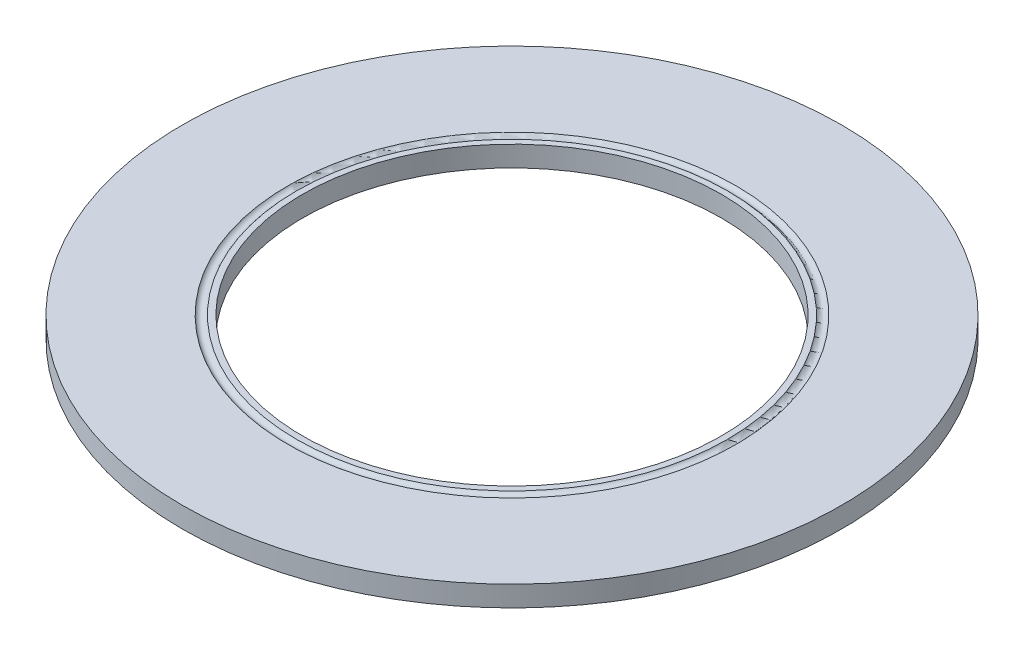
ISO-10303-21;
HEADER;
FILE_DESCRIPTION(('STEP AP214'),'2;1');
FILE_NAME('part.step','',(''),(''),'','','');
FILE_SCHEMA(('AUTOMOTIVE_DESIGN { 1 0 10303 214 1 1 1 1 }'));
ENDSEC;
DATA;
#1=APPLICATION_CONTEXT('core data for automotive mechanical design processes');
#2=APPLICATION_PROTOCOL_DEFINITION('international standard','automotive_design',2000,#1);
#3=PRODUCT_CONTEXT('',#1,'mechanical');
#4=PRODUCT('Part','Part','',(#3));
#5=PRODUCT_RELATED_PRODUCT_CATEGORY('part','',(#4));
#6=PRODUCT_DEFINITION_FORMATION('','',#4);
#7=PRODUCT_DEFINITION_CONTEXT('part definition',#1,'design');
#8=PRODUCT_DEFINITION('design','',#6,#7);
#9=PRODUCT_DEFINITION_SHAPE('','',#8);
#10=(LENGTH_UNIT() NAMED_UNIT(*) SI_UNIT(.MILLI.,.METRE.));
#11=(NAMED_UNIT(*) PLANE_ANGLE_UNIT() SI_UNIT($,.RADIAN.));
#12=(NAMED_UNIT(*) SI_UNIT($,.STERADIAN.) SOLID_ANGLE_UNIT());
#13=UNCERTAINTY_MEASURE_WITH_UNIT(LENGTH_MEASURE(1.E-05),#10,'distance_accuracy_value','');
#14=(GEOMETRIC_REPRESENTATION_CONTEXT(3) GLOBAL_UNCERTAINTY_ASSIGNED_CONTEXT((#13)) GLOBAL_UNIT_ASSIGNED_CONTEXT((#10,
#11,#12)) REPRESENTATION_CONTEXT('',''));
#15=CARTESIAN_POINT('',(0.,0.,0.));
#16=DIRECTION('',(0.,0.,1.));
#17=DIRECTION('',(1.,0.,0.));
#18=AXIS2_PLACEMENT_3D('',#15,#16,#17);
#19=CARTESIAN_POINT('',(0.,-1.27,0.));
#20=DIRECTION('',(0.,-1.,0.));
#21=DIRECTION('',(0.,0.,-1.));
#22=AXIS2_PLACEMENT_3D('',#19,#20,#21);
#23=TOROIDAL_SURFACE('',#22,101.6,2.38125000000001);
#24=CARTESIAN_POINT('',(0.,0.,0.));
#25=DIRECTION('',(0.,-1.,0.));
#26=DIRECTION('',(0.,0.,-1.));
#27=AXIS2_PLACEMENT_3D('',#24,#25,#26);
#28=CIRCLE('',#27,103.614311684546);
#29=CARTESIAN_POINT('',(0.,0.,-103.614311684546));
#30=VERTEX_POINT('',#29);
#31=EDGE_CURVE('E69',#30,#30,#28,.T.);
#32=ORIENTED_EDGE('',*,*,#31,.T.);
#33=EDGE_LOOP('',(#32));
#34=FACE_BOUND('',#33,.T.);
#35=CARTESIAN_POINT('',(0.,0.,0.));
#36=DIRECTION('',(0.,-1.,0.));
#37=DIRECTION('',(0.,0.,-1.));
#38=AXIS2_PLACEMENT_3D('',#35,#36,#37);
#39=CIRCLE('',#38,99.5856883154536);
#40=CARTESIAN_POINT('',(0.,0.,-99.5856883154536));
#41=VERTEX_POINT('',#40);
#42=EDGE_CURVE('E10',#41,#41,#39,.T.);
#43=ORIENTED_EDGE('',*,*,#42,.F.);
#44=EDGE_LOOP('',(#43));
#45=FACE_BOUND('',#44,.T.);
#46=ADVANCED_FACE('F41',(#34,#45),#23,.F.);
#47=CARTESIAN_POINT('',(0.,0.,0.));
#48=DIRECTION('',(0.,-1.,0.));
#49=DIRECTION('',(0.,0.,-1.));
#50=AXIS2_PLACEMENT_3D('',#47,#48,#49);
#51=PLANE('',#50);
#52=ORIENTED_EDGE('',*,*,#42,.T.);
#53=EDGE_LOOP('',(#52));
#54=FACE_BOUND('',#53,.T.);
#55=CARTESIAN_POINT('',(0.,0.,0.));
#56=DIRECTION('',(0.,-1.,0.));
#57=DIRECTION('',(0.,0.,-1.));
#58=AXIS2_PLACEMENT_3D('',#55,#56,#57);
#59=CIRCLE('',#58,96.8375);
#60=CARTESIAN_POINT('',(0.,0.,-96.8375));
#61=VERTEX_POINT('',#60);
#62=EDGE_CURVE('E47',#61,#61,#59,.T.);
#63=ORIENTED_EDGE('',*,*,#62,.F.);
#64=EDGE_LOOP('',(#63));
#65=FACE_BOUND('',#64,.T.);
#66=ADVANCED_FACE('F87',(#54,#65),#51,.T.);
#67=CARTESIAN_POINT('',(0.,0.,0.));
#68=DIRECTION('',(0.,-1.,0.));
#69=DIRECTION('',(0.,0.,-1.));
#70=AXIS2_PLACEMENT_3D('',#67,#68,#69);
#71=CYLINDRICAL_SURFACE('',#70,96.8375);
#72=CARTESIAN_POINT('',(0.,9.525,0.));
#73=DIRECTION('',(0.,-1.,0.));
#74=DIRECTION('',(0.,0.,-1.));
#75=AXIS2_PLACEMENT_3D('',#72,#73,#74);
#76=CIRCLE('',#75,96.8375);
#77=CARTESIAN_POINT('',(0.,9.525,-96.8375));
#78=VERTEX_POINT('',#77);
#79=EDGE_CURVE('E51',#78,#78,#76,.T.);
#80=ORIENTED_EDGE('',*,*,#79,.F.);
#81=EDGE_LOOP('',(#80));
#82=FACE_BOUND('',#81,.T.);
#83=ORIENTED_EDGE('',*,*,#62,.T.);
#84=EDGE_LOOP('',(#83));
#85=FACE_BOUND('',#84,.T.);
#86=ADVANCED_FACE('F91',(#82,#85),#71,.F.);
#87=CARTESIAN_POINT('',(0.,9.525,0.));
#88=DIRECTION('',(0.,-1.,0.));
#89=DIRECTION('',(0.,0.,-1.));
#90=AXIS2_PLACEMENT_3D('',#87,#88,#89);
#91=PLANE('',#90);
#92=CARTESIAN_POINT('',(0.,9.525,0.));
#93=DIRECTION('',(0.,-1.,0.));
#94=DIRECTION('',(0.,0.,-1.));
#95=AXIS2_PLACEMENT_3D('',#92,#93,#94);
#96=CIRCLE('',#95,99.5856883154536);
#97=CARTESIAN_POINT('',(0.,9.525,-99.5856883154536));
#98=VERTEX_POINT('',#97);
#99=EDGE_CURVE('E55',#98,#98,#96,.T.);
#100=ORIENTED_EDGE('',*,*,#99,.F.);
#101=EDGE_LOOP('',(#100));
#102=FACE_BOUND('',#101,.T.);
#103=ORIENTED_EDGE('',*,*,#79,.T.);
#104=EDGE_LOOP('',(#103));
#105=FACE_BOUND('',#104,.T.);
#106=ADVANCED_FACE('F95',(#102,#105),#91,.F.);
#107=CARTESIAN_POINT('',(0.,10.795,0.));
#108=DIRECTION('',(0.,-1.,0.));
#109=DIRECTION('',(0.,0.,-1.));
#110=AXIS2_PLACEMENT_3D('',#107,#108,#109);
#111=TOROIDAL_SURFACE('',#110,101.6,2.38125);
#112=ORIENTED_EDGE('',*,*,#99,.T.);
#113=EDGE_LOOP('',(#112));
#114=FACE_BOUND('',#113,.T.);
#115=CARTESIAN_POINT('',(0.,9.52499999999999,0.));
#116=DIRECTION('',(0.,-1.,0.));
#117=DIRECTION('',(0.,0.,-1.));
#118=AXIS2_PLACEMENT_3D('',#115,#116,#117);
#119=CIRCLE('',#118,103.614311684546);
#120=CARTESIAN_POINT('',(0.,9.52499999999999,-103.614311684546));
#121=VERTEX_POINT('',#120);
#122=EDGE_CURVE('E60',#121,#121,#119,.T.);
#123=ORIENTED_EDGE('',*,*,#122,.F.);
#124=EDGE_LOOP('',(#123));
#125=FACE_BOUND('',#124,.T.);
#126=ADVANCED_FACE('F102',(#114,#125),#111,.F.);
#127=CARTESIAN_POINT('',(0.,9.52499999999999,0.));
#128=DIRECTION('',(0.,1.,0.));
#129=DIRECTION('',(0.,0.,1.));
#130=AXIS2_PLACEMENT_3D('',#127,#128,#129);
#131=PLANE('',#130);
#132=ORIENTED_EDGE('',*,*,#122,.T.);
#133=EDGE_LOOP('',(#132));
#134=FACE_BOUND('',#133,.T.);
#135=CARTESIAN_POINT('',(0.,9.52499999999999,0.));
#136=DIRECTION('',(0.,-1.,0.));
#137=DIRECTION('',(0.,0.,-1.));
#138=AXIS2_PLACEMENT_3D('',#135,#136,#137);
#139=CIRCLE('',#138,152.4);
#140=CARTESIAN_POINT('',(0.,9.52499999999999,-152.4));
#141=VERTEX_POINT('',#140);
#142=EDGE_CURVE('E63',#141,#141,#139,.T.);
#143=ORIENTED_EDGE('',*,*,#142,.F.);
#144=EDGE_LOOP('',(#143));
#145=FACE_BOUND('',#144,.T.);
#146=ADVANCED_FACE('F83',(#134,#145),#131,.T.);
#147=CARTESIAN_POINT('',(0.,0.,0.));
#148=DIRECTION('',(0.,-1.,0.));
#149=DIRECTION('',(0.,0.,-1.));
#150=AXIS2_PLACEMENT_3D('',#147,#148,#149);
#151=CYLINDRICAL_SURFACE('',#150,152.4);
#152=ORIENTED_EDGE('',*,*,#142,.T.);
#153=EDGE_LOOP('',(#152));
#154=FACE_BOUND('',#153,.T.);
#155=CARTESIAN_POINT('',(0.,0.,0.));
#156=DIRECTION('',(0.,-1.,0.));
#157=DIRECTION('',(0.,0.,-1.));
#158=AXIS2_PLACEMENT_3D('',#155,#156,#157);
#159=CIRCLE('',#158,152.4);
#160=CARTESIAN_POINT('',(0.,0.,-152.4));
#161=VERTEX_POINT('',#160);
#162=EDGE_CURVE('E66',#161,#161,#159,.T.);
#163=ORIENTED_EDGE('',*,*,#162,.F.);
#164=EDGE_LOOP('',(#163));
#165=FACE_BOUND('',#164,.T.);
#166=ADVANCED_FACE('F77',(#154,#165),#151,.T.);
#167=CARTESIAN_POINT('',(0.,0.,0.));
#168=DIRECTION('',(0.,-1.,0.));
#169=DIRECTION('',(0.,0.,-1.));
#170=AXIS2_PLACEMENT_3D('',#167,#168,#169);
#171=PLANE('',#170);
#172=ORIENTED_EDGE('',*,*,#162,.T.);
#173=EDGE_LOOP('',(#172));
#174=FACE_BOUND('',#173,.T.);
#175=ORIENTED_EDGE('',*,*,#31,.F.);
#176=EDGE_LOOP('',(#175));
#177=FACE_BOUND('',#176,.T.);
#178=ADVANCED_FACE('F75',(#174,#177),#171,.T.);
#179=CLOSED_SHELL('',(#46,#66,#86,#106,#126,#146,#166,#178));
#180=MANIFOLD_SOLID_BREP('B2',#179);
#181=ADVANCED_BREP_SHAPE_REPRESENTATION('',(#18,#180),#14);
#182=SHAPE_DEFINITION_REPRESENTATION(#9,#181);
ENDSEC;
END-ISO-10303-21;
